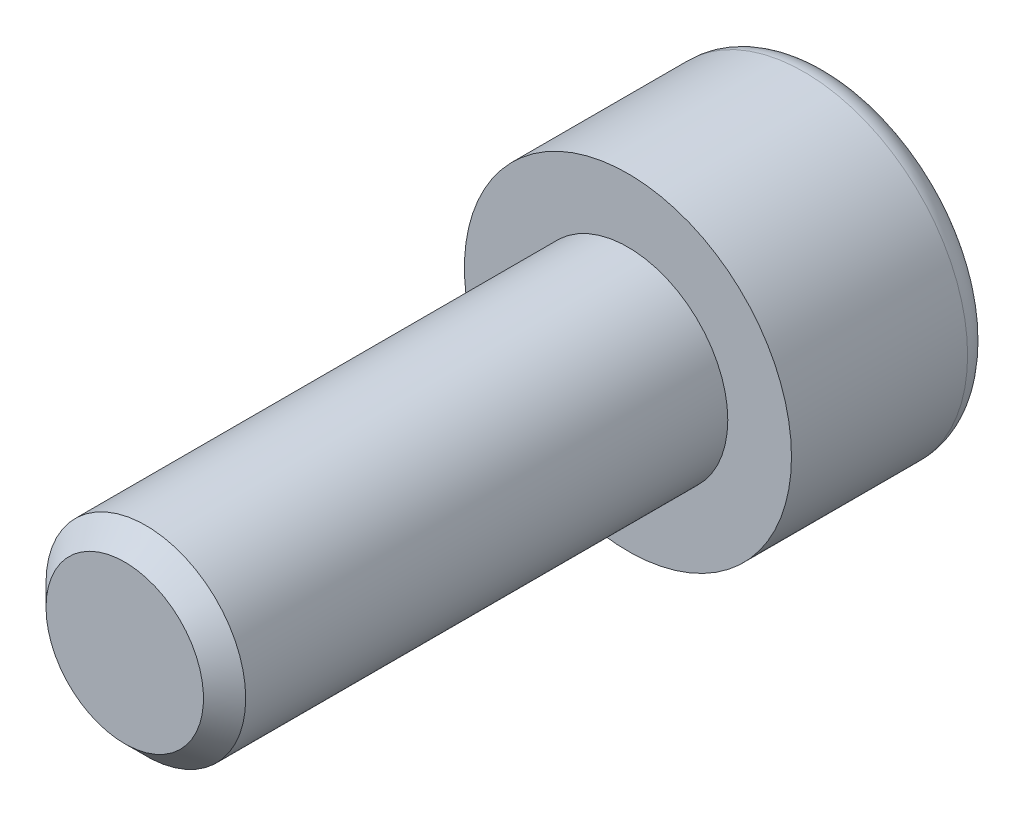
ISO-10303-21;
HEADER;
FILE_DESCRIPTION(('STEP AP214'),'2;1');
FILE_NAME('part.step','',(''),(''),'','','');
FILE_SCHEMA(('AUTOMOTIVE_DESIGN { 1 0 10303 214 1 1 1 1 }'));
ENDSEC;
DATA;
#1=APPLICATION_CONTEXT('core data for automotive mechanical design processes');
#2=APPLICATION_PROTOCOL_DEFINITION('international standard','automotive_design',2000,#1);
#3=PRODUCT_CONTEXT('',#1,'mechanical');
#4=PRODUCT('Part','Part','',(#3));
#5=PRODUCT_RELATED_PRODUCT_CATEGORY('part','',(#4));
#6=PRODUCT_DEFINITION_FORMATION('','',#4);
#7=PRODUCT_DEFINITION_CONTEXT('part definition',#1,'design');
#8=PRODUCT_DEFINITION('design','',#6,#7);
#9=PRODUCT_DEFINITION_SHAPE('','',#8);
#10=(LENGTH_UNIT() NAMED_UNIT(*) SI_UNIT(.MILLI.,.METRE.));
#11=(NAMED_UNIT(*) PLANE_ANGLE_UNIT() SI_UNIT($,.RADIAN.));
#12=(NAMED_UNIT(*) SI_UNIT($,.STERADIAN.) SOLID_ANGLE_UNIT());
#13=UNCERTAINTY_MEASURE_WITH_UNIT(LENGTH_MEASURE(1.E-05),#10,'distance_accuracy_value','');
#14=(GEOMETRIC_REPRESENTATION_CONTEXT(3) GLOBAL_UNCERTAINTY_ASSIGNED_CONTEXT((#13)) GLOBAL_UNIT_ASSIGNED_CONTEXT((#10,
#11,#12)) REPRESENTATION_CONTEXT('',''));
#15=CARTESIAN_POINT('',(0.,0.,0.));
#16=DIRECTION('',(0.,0.,1.));
#17=DIRECTION('',(1.,0.,0.));
#18=AXIS2_PLACEMENT_3D('',#15,#16,#17);
#19=CARTESIAN_POINT('',(0.,0.,0.));
#20=DIRECTION('',(0.,0.,1.));
#21=DIRECTION('',(1.,0.,0.));
#22=AXIS2_PLACEMENT_3D('',#19,#20,#21);
#23=PLANE('',#22);
#24=CARTESIAN_POINT('',(0.,0.,0.));
#25=DIRECTION('',(0.,0.,1.));
#26=DIRECTION('',(1.,0.,0.));
#27=AXIS2_PLACEMENT_3D('',#24,#25,#26);
#28=CIRCLE('',#27,5.5);
#29=CARTESIAN_POINT('',(5.5,0.,0.));
#30=VERTEX_POINT('',#29);
#31=EDGE_CURVE('E169',#30,#30,#28,.F.);
#32=ORIENTED_EDGE('',*,*,#31,.T.);
#33=EDGE_LOOP('',(#32));
#34=FACE_BOUND('',#33,.T.);
#35=DIRECTION('',(-0.5,0.866025403784439,0.));
#36=VECTOR('',#35,1.);
#37=CARTESIAN_POINT('',(-2.625,-1.51554445662277,0.));
#38=LINE('',#37,#36);
#39=CARTESIAN_POINT('',(-1.75,-3.03108891324554,0.));
#40=VERTEX_POINT('',#39);
#41=CARTESIAN_POINT('',(-3.5,0.,0.));
#42=VERTEX_POINT('',#41);
#43=EDGE_CURVE('E11',#40,#42,#38,.T.);
#44=ORIENTED_EDGE('',*,*,#43,.F.);
#45=DIRECTION('',(-1.,0.,0.));
#46=VECTOR('',#45,1.);
#47=CARTESIAN_POINT('',(0.,-3.03108891324554,0.));
#48=LINE('',#47,#46);
#49=CARTESIAN_POINT('',(1.75,-3.03108891324554,0.));
#50=VERTEX_POINT('',#49);
#51=EDGE_CURVE('E173',#50,#40,#48,.T.);
#52=ORIENTED_EDGE('',*,*,#51,.F.);
#53=DIRECTION('',(-0.5,-0.866025403784439,0.));
#54=VECTOR('',#53,1.);
#55=CARTESIAN_POINT('',(2.625,-1.51554445662277,0.));
#56=LINE('',#55,#54);
#57=CARTESIAN_POINT('',(3.5,0.,0.));
#58=VERTEX_POINT('',#57);
#59=EDGE_CURVE('E176',#58,#50,#56,.T.);
#60=ORIENTED_EDGE('',*,*,#59,.F.);
#61=DIRECTION('',(0.5,-0.866025403784439,0.));
#62=VECTOR('',#61,1.);
#63=CARTESIAN_POINT('',(2.625,1.51554445662277,0.));
#64=LINE('',#63,#62);
#65=CARTESIAN_POINT('',(1.75,3.03108891324554,0.));
#66=VERTEX_POINT('',#65);
#67=EDGE_CURVE('E179',#66,#58,#64,.T.);
#68=ORIENTED_EDGE('',*,*,#67,.F.);
#69=DIRECTION('',(1.,0.,0.));
#70=VECTOR('',#69,1.);
#71=CARTESIAN_POINT('',(0.,3.03108891324554,0.));
#72=LINE('',#71,#70);
#73=CARTESIAN_POINT('',(-1.75,3.03108891324554,0.));
#74=VERTEX_POINT('',#73);
#75=EDGE_CURVE('E182',#74,#66,#72,.T.);
#76=ORIENTED_EDGE('',*,*,#75,.F.);
#77=DIRECTION('',(0.5,0.866025403784439,0.));
#78=VECTOR('',#77,1.);
#79=CARTESIAN_POINT('',(-2.625,1.51554445662277,0.));
#80=LINE('',#79,#78);
#81=EDGE_CURVE('E56',#42,#74,#80,.T.);
#82=ORIENTED_EDGE('',*,*,#81,.F.);
#83=EDGE_LOOP('',(#44,#52,#60,#68,#76,#82));
#84=FACE_BOUND('',#83,.T.);
#85=ADVANCED_FACE('F47',(#34,#84),#23,.F.);
#86=CARTESIAN_POINT('',(0.,0.,8.));
#87=DIRECTION('',(0.,0.,-1.));
#88=DIRECTION('',(-1.,0.,0.));
#89=AXIS2_PLACEMENT_3D('',#86,#87,#88);
#90=CYLINDRICAL_SURFACE('',#89,6.5);
#91=CARTESIAN_POINT('',(0.,0.,1.));
#92=DIRECTION('',(0.,0.,1.));
#93=DIRECTION('',(1.,0.,0.));
#94=AXIS2_PLACEMENT_3D('',#91,#92,#93);
#95=CIRCLE('',#94,6.5);
#96=CARTESIAN_POINT('',(6.5,0.,1.));
#97=VERTEX_POINT('',#96);
#98=EDGE_CURVE('E165',#97,#97,#95,.T.);
#99=ORIENTED_EDGE('',*,*,#98,.T.);
#100=EDGE_LOOP('',(#99));
#101=FACE_BOUND('',#100,.T.);
#102=CARTESIAN_POINT('',(0.,0.,8.));
#103=DIRECTION('',(0.,0.,1.));
#104=DIRECTION('',(1.,0.,0.));
#105=AXIS2_PLACEMENT_3D('',#102,#103,#104);
#106=CIRCLE('',#105,6.5);
#107=CARTESIAN_POINT('',(6.5,0.,8.));
#108=VERTEX_POINT('',#107);
#109=EDGE_CURVE('E161',#108,#108,#106,.T.);
#110=ORIENTED_EDGE('',*,*,#109,.F.);
#111=EDGE_LOOP('',(#110));
#112=FACE_BOUND('',#111,.T.);
#113=ADVANCED_FACE('F210',(#101,#112),#90,.T.);
#114=CARTESIAN_POINT('',(0.,0.,8.));
#115=DIRECTION('',(0.,0.,1.));
#116=DIRECTION('',(1.,0.,0.));
#117=AXIS2_PLACEMENT_3D('',#114,#115,#116);
#118=PLANE('',#117);
#119=ORIENTED_EDGE('',*,*,#109,.T.);
#120=EDGE_LOOP('',(#119));
#121=FACE_BOUND('',#120,.T.);
#122=CARTESIAN_POINT('',(0.,0.,8.));
#123=DIRECTION('',(0.,0.,-1.));
#124=DIRECTION('',(-1.,0.,0.));
#125=AXIS2_PLACEMENT_3D('',#122,#123,#124);
#126=CIRCLE('',#125,3.96875);
#127=CARTESIAN_POINT('',(-3.96875,0.,8.));
#128=VERTEX_POINT('',#127);
#129=EDGE_CURVE('E157',#128,#128,#126,.T.);
#130=ORIENTED_EDGE('',*,*,#129,.T.);
#131=EDGE_LOOP('',(#130));
#132=FACE_BOUND('',#131,.T.);
#133=ADVANCED_FACE('F218',(#121,#132),#118,.T.);
#134=CARTESIAN_POINT('',(0.,0.,28.));
#135=DIRECTION('',(0.,0.,-1.));
#136=DIRECTION('',(-1.,0.,0.));
#137=AXIS2_PLACEMENT_3D('',#134,#135,#136);
#138=CYLINDRICAL_SURFACE('',#137,3.96875);
#139=ORIENTED_EDGE('',*,*,#129,.F.);
#140=EDGE_LOOP('',(#139));
#141=FACE_BOUND('',#140,.T.);
#142=CARTESIAN_POINT('',(0.,0.,27.16053));
#143=DIRECTION('',(0.,0.,-1.));
#144=DIRECTION('',(-1.,0.,0.));
#145=AXIS2_PLACEMENT_3D('',#142,#143,#144);
#146=CIRCLE('',#145,3.96875);
#147=CARTESIAN_POINT('',(-3.96875,0.,27.16053));
#148=VERTEX_POINT('',#147);
#149=EDGE_CURVE('E107',#148,#148,#146,.T.);
#150=ORIENTED_EDGE('',*,*,#149,.T.);
#151=EDGE_LOOP('',(#150));
#152=FACE_BOUND('',#151,.T.);
#153=ADVANCED_FACE('F223',(#141,#152),#138,.T.);
#154=CARTESIAN_POINT('',(0.,0.,28.));
#155=DIRECTION('',(0.,0.,-1.));
#156=DIRECTION('',(-1.,0.,0.));
#157=AXIS2_PLACEMENT_3D('',#154,#155,#156);
#158=CONICAL_SURFACE('',#157,3.12928,0.785398163397457);
#159=ORIENTED_EDGE('',*,*,#149,.F.);
#160=EDGE_LOOP('',(#159));
#161=FACE_BOUND('',#160,.T.);
#162=CARTESIAN_POINT('',(0.,0.,28.));
#163=DIRECTION('',(0.,0.,-1.));
#164=DIRECTION('',(-1.,0.,0.));
#165=AXIS2_PLACEMENT_3D('',#162,#163,#164);
#166=CIRCLE('',#165,3.12928);
#167=CARTESIAN_POINT('',(-3.12928,0.,28.));
#168=VERTEX_POINT('',#167);
#169=EDGE_CURVE('E153',#168,#168,#166,.T.);
#170=ORIENTED_EDGE('',*,*,#169,.T.);
#171=EDGE_LOOP('',(#170));
#172=FACE_BOUND('',#171,.T.);
#173=ADVANCED_FACE('F228',(#161,#172),#158,.T.);
#174=CARTESIAN_POINT('',(0.,0.,28.));
#175=DIRECTION('',(0.,0.,1.));
#176=DIRECTION('',(1.,0.,0.));
#177=AXIS2_PLACEMENT_3D('',#174,#175,#176);
#178=PLANE('',#177);
#179=ORIENTED_EDGE('',*,*,#169,.F.);
#180=EDGE_LOOP('',(#179));
#181=FACE_BOUND('',#180,.T.);
#182=ADVANCED_FACE('F225',(#181),#178,.T.);
#183=CARTESIAN_POINT('',(0.,0.,1.));
#184=DIRECTION('',(0.,0.,1.));
#185=DIRECTION('',(1.,0.,0.));
#186=AXIS2_PLACEMENT_3D('',#183,#184,#185);
#187=TOROIDAL_SURFACE('',#186,5.5,1.);
#188=ORIENTED_EDGE('',*,*,#31,.F.);
#189=EDGE_LOOP('',(#188));
#190=FACE_BOUND('',#189,.T.);
#191=ORIENTED_EDGE('',*,*,#98,.F.);
#192=EDGE_LOOP('',(#191));
#193=FACE_BOUND('',#192,.T.);
#194=ADVANCED_FACE('F49',(#190,#193),#187,.T.);
#195=CARTESIAN_POINT('',(-1.75,-3.03108891324554,-1.2E-05));
#196=DIRECTION('',(0.866025403784439,0.5,0.));
#197=DIRECTION('',(-0.5,0.866025403784439,0.));
#198=AXIS2_PLACEMENT_3D('',#195,#196,#197);
#199=PLANE('',#198);
#200=ORIENTED_EDGE('',*,*,#43,.T.);
#201=DIRECTION('',(0.,0.,1.));
#202=VECTOR('',#201,1.);
#203=CARTESIAN_POINT('',(-3.5,0.,-1.2E-05));
#204=LINE('',#203,#202);
#205=CARTESIAN_POINT('',(-3.5,0.,2.));
#206=VERTEX_POINT('',#205);
#207=EDGE_CURVE('E98',#42,#206,#204,.T.);
#208=ORIENTED_EDGE('',*,*,#207,.T.);
#209=DIRECTION('',(-0.5,0.866025403784439,0.));
#210=VECTOR('',#209,1.);
#211=CARTESIAN_POINT('',(-1.75,-3.03108891324554,2.));
#212=LINE('',#211,#210);
#213=CARTESIAN_POINT('',(-1.75,-3.03108891324554,2.));
#214=VERTEX_POINT('',#213);
#215=EDGE_CURVE('E102',#214,#206,#212,.T.);
#216=ORIENTED_EDGE('',*,*,#215,.F.);
#217=DIRECTION('',(0.,0.,1.));
#218=VECTOR('',#217,1.);
#219=CARTESIAN_POINT('',(-1.75,-3.03108891324554,-1.2E-05));
#220=LINE('',#219,#218);
#221=EDGE_CURVE('E137',#40,#214,#220,.T.);
#222=ORIENTED_EDGE('',*,*,#221,.F.);
#223=EDGE_LOOP('',(#200,#208,#216,#222));
#224=FACE_BOUND('',#223,.T.);
#225=ADVANCED_FACE('F100',(#224),#199,.T.);
#226=CARTESIAN_POINT('',(-3.5,0.,-1.2E-05));
#227=DIRECTION('',(0.866025403784439,-0.5,0.));
#228=DIRECTION('',(0.5,0.866025403784439,0.));
#229=AXIS2_PLACEMENT_3D('',#226,#227,#228);
#230=PLANE('',#229);
#231=ORIENTED_EDGE('',*,*,#81,.T.);
#232=DIRECTION('',(0.,0.,1.));
#233=VECTOR('',#232,1.);
#234=CARTESIAN_POINT('',(-1.75,3.03108891324554,-1.2E-05));
#235=LINE('',#234,#233);
#236=CARTESIAN_POINT('',(-1.75,3.03108891324554,2.));
#237=VERTEX_POINT('',#236);
#238=EDGE_CURVE('E108',#74,#237,#235,.T.);
#239=ORIENTED_EDGE('',*,*,#238,.T.);
#240=DIRECTION('',(0.5,0.866025403784438,0.));
#241=VECTOR('',#240,1.);
#242=CARTESIAN_POINT('',(-3.5,0.,2.));
#243=LINE('',#242,#241);
#244=EDGE_CURVE('E111',#206,#237,#243,.T.);
#245=ORIENTED_EDGE('',*,*,#244,.F.);
#246=ORIENTED_EDGE('',*,*,#207,.F.);
#247=EDGE_LOOP('',(#231,#239,#245,#246));
#248=FACE_BOUND('',#247,.T.);
#249=ADVANCED_FACE('F112',(#248),#230,.T.);
#250=CARTESIAN_POINT('',(-1.75,3.03108891324554,-1.2E-05));
#251=DIRECTION('',(0.,-1.,0.));
#252=DIRECTION('',(1.,0.,0.));
#253=AXIS2_PLACEMENT_3D('',#250,#251,#252);
#254=PLANE('',#253);
#255=ORIENTED_EDGE('',*,*,#75,.T.);
#256=DIRECTION('',(0.,0.,1.));
#257=VECTOR('',#256,1.);
#258=CARTESIAN_POINT('',(1.75,3.03108891324554,-1.2E-05));
#259=LINE('',#258,#257);
#260=CARTESIAN_POINT('',(1.75,3.03108891324554,2.));
#261=VERTEX_POINT('',#260);
#262=EDGE_CURVE('E145',#66,#261,#259,.T.);
#263=ORIENTED_EDGE('',*,*,#262,.T.);
#264=DIRECTION('',(1.,0.,0.));
#265=VECTOR('',#264,1.);
#266=CARTESIAN_POINT('',(-1.75,3.03108891324554,2.));
#267=LINE('',#266,#265);
#268=EDGE_CURVE('E118',#237,#261,#267,.T.);
#269=ORIENTED_EDGE('',*,*,#268,.F.);
#270=ORIENTED_EDGE('',*,*,#238,.F.);
#271=EDGE_LOOP('',(#255,#263,#269,#270));
#272=FACE_BOUND('',#271,.T.);
#273=ADVANCED_FACE('F188',(#272),#254,.T.);
#274=CARTESIAN_POINT('',(1.75,3.03108891324554,-1.2E-05));
#275=DIRECTION('',(-0.866025403784439,-0.5,0.));
#276=DIRECTION('',(0.5,-0.866025403784439,0.));
#277=AXIS2_PLACEMENT_3D('',#274,#275,#276);
#278=PLANE('',#277);
#279=ORIENTED_EDGE('',*,*,#67,.T.);
#280=DIRECTION('',(0.,0.,1.));
#281=VECTOR('',#280,1.);
#282=CARTESIAN_POINT('',(3.5,0.,-1.2E-05));
#283=LINE('',#282,#281);
#284=CARTESIAN_POINT('',(3.5,0.,2.));
#285=VERTEX_POINT('',#284);
#286=EDGE_CURVE('E142',#58,#285,#283,.T.);
#287=ORIENTED_EDGE('',*,*,#286,.T.);
#288=DIRECTION('',(0.5,-0.866025403784439,0.));
#289=VECTOR('',#288,1.);
#290=CARTESIAN_POINT('',(1.75,3.03108891324554,2.));
#291=LINE('',#290,#289);
#292=EDGE_CURVE('E128',#261,#285,#291,.T.);
#293=ORIENTED_EDGE('',*,*,#292,.F.);
#294=ORIENTED_EDGE('',*,*,#262,.F.);
#295=EDGE_LOOP('',(#279,#287,#293,#294));
#296=FACE_BOUND('',#295,.T.);
#297=ADVANCED_FACE('F195',(#296),#278,.T.);
#298=CARTESIAN_POINT('',(3.5,0.,-1.2E-05));
#299=DIRECTION('',(-0.866025403784439,0.5,0.));
#300=DIRECTION('',(-0.5,-0.866025403784439,0.));
#301=AXIS2_PLACEMENT_3D('',#298,#299,#300);
#302=PLANE('',#301);
#303=ORIENTED_EDGE('',*,*,#59,.T.);
#304=DIRECTION('',(0.,0.,1.));
#305=VECTOR('',#304,1.);
#306=CARTESIAN_POINT('',(1.75,-3.03108891324554,-1.2E-05));
#307=LINE('',#306,#305);
#308=CARTESIAN_POINT('',(1.75,-3.03108891324554,2.));
#309=VERTEX_POINT('',#308);
#310=EDGE_CURVE('E63',#50,#309,#307,.T.);
#311=ORIENTED_EDGE('',*,*,#310,.T.);
#312=DIRECTION('',(-0.5,-0.866025403784439,0.));
#313=VECTOR('',#312,1.);
#314=CARTESIAN_POINT('',(3.5,0.,2.));
#315=LINE('',#314,#313);
#316=EDGE_CURVE('E132',#285,#309,#315,.T.);
#317=ORIENTED_EDGE('',*,*,#316,.F.);
#318=ORIENTED_EDGE('',*,*,#286,.F.);
#319=EDGE_LOOP('',(#303,#311,#317,#318));
#320=FACE_BOUND('',#319,.T.);
#321=ADVANCED_FACE('F199',(#320),#302,.T.);
#322=CARTESIAN_POINT('',(1.75,-3.03108891324554,-1.2E-05));
#323=DIRECTION('',(0.,1.,0.));
#324=DIRECTION('',(-1.,0.,0.));
#325=AXIS2_PLACEMENT_3D('',#322,#323,#324);
#326=PLANE('',#325);
#327=ORIENTED_EDGE('',*,*,#51,.T.);
#328=ORIENTED_EDGE('',*,*,#221,.T.);
#329=DIRECTION('',(-1.,0.,0.));
#330=VECTOR('',#329,1.);
#331=CARTESIAN_POINT('',(1.75,-3.03108891324554,2.));
#332=LINE('',#331,#330);
#333=EDGE_CURVE('E122',#309,#214,#332,.T.);
#334=ORIENTED_EDGE('',*,*,#333,.F.);
#335=ORIENTED_EDGE('',*,*,#310,.F.);
#336=EDGE_LOOP('',(#327,#328,#334,#335));
#337=FACE_BOUND('',#336,.T.);
#338=ADVANCED_FACE('F200',(#337),#326,.T.);
#339=CARTESIAN_POINT('',(0.,0.,2.));
#340=DIRECTION('',(0.,0.,-1.));
#341=DIRECTION('',(-1.,0.,0.));
#342=AXIS2_PLACEMENT_3D('',#339,#340,#341);
#343=PLANE('',#342);
#344=ORIENTED_EDGE('',*,*,#215,.T.);
#345=ORIENTED_EDGE('',*,*,#244,.T.);
#346=ORIENTED_EDGE('',*,*,#268,.T.);
#347=ORIENTED_EDGE('',*,*,#292,.T.);
#348=ORIENTED_EDGE('',*,*,#316,.T.);
#349=ORIENTED_EDGE('',*,*,#333,.T.);
#350=EDGE_LOOP('',(#344,#345,#346,#347,#348,#349));
#351=FACE_BOUND('',#350,.T.);
#352=ADVANCED_FACE('F120',(#351),#343,.T.);
#353=CLOSED_SHELL('',(#85,#113,#133,#153,#173,#182,#194,#225,#249,#273,#297,#321,#338,#352));
#354=MANIFOLD_SOLID_BREP('B2',#353);
#355=ADVANCED_BREP_SHAPE_REPRESENTATION('',(#18,#354),#14);
#356=SHAPE_DEFINITION_REPRESENTATION(#9,#355);
ENDSEC;
END-ISO-10303-21;
